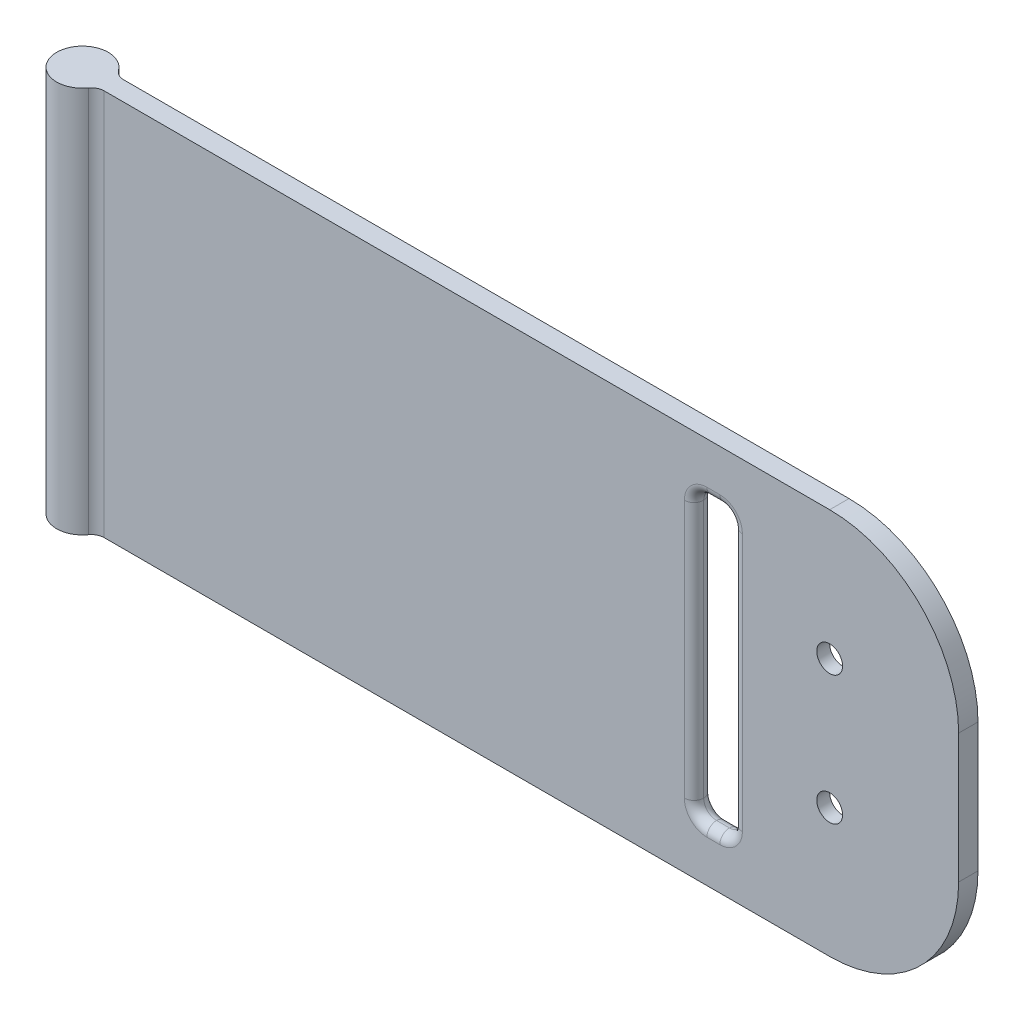
ISO-10303-21;
HEADER;
FILE_DESCRIPTION(('STEP AP214'),'2;1');
FILE_NAME('part.step','',(''),(''),'','','');
FILE_SCHEMA(('AUTOMOTIVE_DESIGN { 1 0 10303 214 1 1 1 1 }'));
ENDSEC;
DATA;
#1=APPLICATION_CONTEXT('core data for automotive mechanical design processes');
#2=APPLICATION_PROTOCOL_DEFINITION('international standard','automotive_design',2000,#1);
#3=PRODUCT_CONTEXT('',#1,'mechanical');
#4=PRODUCT('Part','Part','',(#3));
#5=PRODUCT_RELATED_PRODUCT_CATEGORY('part','',(#4));
#6=PRODUCT_DEFINITION_FORMATION('','',#4);
#7=PRODUCT_DEFINITION_CONTEXT('part definition',#1,'design');
#8=PRODUCT_DEFINITION('design','',#6,#7);
#9=PRODUCT_DEFINITION_SHAPE('','',#8);
#10=(LENGTH_UNIT() NAMED_UNIT(*) SI_UNIT(.MILLI.,.METRE.));
#11=(NAMED_UNIT(*) PLANE_ANGLE_UNIT() SI_UNIT($,.RADIAN.));
#12=(NAMED_UNIT(*) SI_UNIT($,.STERADIAN.) SOLID_ANGLE_UNIT());
#13=UNCERTAINTY_MEASURE_WITH_UNIT(LENGTH_MEASURE(1.E-05),#10,'distance_accuracy_value','');
#14=(GEOMETRIC_REPRESENTATION_CONTEXT(3) GLOBAL_UNCERTAINTY_ASSIGNED_CONTEXT((#13)) GLOBAL_UNIT_ASSIGNED_CONTEXT((#10,
#11,#12)) REPRESENTATION_CONTEXT('',''));
#15=CARTESIAN_POINT('',(0.,0.,0.));
#16=DIRECTION('',(0.,0.,1.));
#17=DIRECTION('',(1.,0.,0.));
#18=AXIS2_PLACEMENT_3D('',#15,#16,#17);
#19=CARTESIAN_POINT('',(0.,30.,0.));
#20=DIRECTION('',(0.,-1.,0.));
#21=DIRECTION('',(0.,0.,-1.));
#22=AXIS2_PLACEMENT_3D('',#19,#20,#21);
#23=CYLINDRICAL_SURFACE('',#22,2.);
#24=CARTESIAN_POINT('',(0.,0.,0.));
#25=DIRECTION('',(0.,1.,0.));
#26=DIRECTION('',(0.,0.,1.));
#27=AXIS2_PLACEMENT_3D('',#24,#25,#26);
#28=CIRCLE('',#27,2.);
#29=CARTESIAN_POINT('',(1.62446572413483,0.,-1.16666666666667));
#30=VERTEX_POINT('',#29);
#31=CARTESIAN_POINT('',(1.62446572413483,0.,1.16666666666667));
#32=VERTEX_POINT('',#31);
#33=EDGE_CURVE('E270',#30,#32,#28,.T.);
#34=ORIENTED_EDGE('',*,*,#33,.T.);
#35=DIRECTION('',(0.,-1.,0.));
#36=VECTOR('',#35,1.);
#37=CARTESIAN_POINT('',(1.62446572413483,30.,1.16666666666667));
#38=LINE('',#37,#36);
#39=CARTESIAN_POINT('',(1.62446572413483,30.,1.16666666666667));
#40=VERTEX_POINT('',#39);
#41=EDGE_CURVE('E321',#40,#32,#38,.T.);
#42=ORIENTED_EDGE('',*,*,#41,.F.);
#43=CARTESIAN_POINT('',(0.,30.,0.));
#44=DIRECTION('',(0.,1.,0.));
#45=DIRECTION('',(0.,0.,1.));
#46=AXIS2_PLACEMENT_3D('',#43,#44,#45);
#47=CIRCLE('',#46,2.);
#48=CARTESIAN_POINT('',(1.62446572413483,30.,-1.16666666666667));
#49=VERTEX_POINT('',#48);
#50=EDGE_CURVE('E281',#49,#40,#47,.T.);
#51=ORIENTED_EDGE('',*,*,#50,.F.);
#52=DIRECTION('',(0.,-1.,0.));
#53=VECTOR('',#52,1.);
#54=CARTESIAN_POINT('',(1.62446572413483,30.,-1.16666666666667));
#55=LINE('',#54,#53);
#56=EDGE_CURVE('E297',#49,#30,#55,.T.);
#57=ORIENTED_EDGE('',*,*,#56,.T.);
#58=EDGE_LOOP('',(#34,#42,#51,#57));
#59=FACE_BOUND('',#58,.T.);
#60=ADVANCED_FACE('F36',(#59),#23,.T.);
#61=CARTESIAN_POINT('',(2.43669858620224,30.,1.75));
#62=DIRECTION('',(0.,-1.,0.));
#63=DIRECTION('',(0.,0.,-1.));
#64=AXIS2_PLACEMENT_3D('',#61,#62,#63);
#65=CYLINDRICAL_SURFACE('',#64,1.);
#66=CARTESIAN_POINT('',(2.43669858620224,0.,1.75));
#67=DIRECTION('',(0.,-1.,0.));
#68=DIRECTION('',(0.,0.,1.));
#69=AXIS2_PLACEMENT_3D('',#66,#67,#68);
#70=CIRCLE('',#69,1.);
#71=CARTESIAN_POINT('',(2.43669858620224,0.,0.75));
#72=VERTEX_POINT('',#71);
#73=EDGE_CURVE('E94',#32,#72,#70,.T.);
#74=ORIENTED_EDGE('',*,*,#73,.T.);
#75=DIRECTION('',(0.,-1.,0.));
#76=VECTOR('',#75,1.);
#77=CARTESIAN_POINT('',(2.43669858620224,30.,0.75));
#78=LINE('',#77,#76);
#79=CARTESIAN_POINT('',(2.43669858620224,30.,0.75));
#80=VERTEX_POINT('',#79);
#81=EDGE_CURVE('E318',#80,#72,#78,.T.);
#82=ORIENTED_EDGE('',*,*,#81,.F.);
#83=CARTESIAN_POINT('',(2.43669858620224,30.,1.75));
#84=DIRECTION('',(0.,-1.,0.));
#85=DIRECTION('',(0.,0.,1.));
#86=AXIS2_PLACEMENT_3D('',#83,#84,#85);
#87=CIRCLE('',#86,1.);
#88=EDGE_CURVE('E284',#40,#80,#87,.T.);
#89=ORIENTED_EDGE('',*,*,#88,.F.);
#90=ORIENTED_EDGE('',*,*,#41,.T.);
#91=EDGE_LOOP('',(#74,#82,#89,#90));
#92=FACE_BOUND('',#91,.T.);
#93=ADVANCED_FACE('F412',(#92),#65,.F.);
#94=CARTESIAN_POINT('',(68.6834985862022,30.,0.749999999999999));
#95=DIRECTION('',(0.,0.,-1.));
#96=DIRECTION('',(-1.,0.,0.));
#97=AXIS2_PLACEMENT_3D('',#94,#95,#96);
#98=PLANE('',#97);
#99=DIRECTION('',(0.,-1.,0.));
#100=VECTOR('',#99,1.);
#101=CARTESIAN_POINT('',(47.4144885862022,30.,0.749999999999999));
#102=LINE('',#101,#100);
#103=CARTESIAN_POINT('',(47.4144885862022,5.00000000000002,0.749999999999999));
#104=VERTEX_POINT('',#103);
#105=CARTESIAN_POINT('',(47.4144885862022,25.,0.749999999999999));
#106=VERTEX_POINT('',#105);
#107=EDGE_CURVE('E341',#104,#106,#102,.F.);
#108=ORIENTED_EDGE('',*,*,#107,.T.);
#109=CARTESIAN_POINT('',(49.1644885862022,25.,0.749999999999999));
#110=DIRECTION('',(0.,0.,-1.));
#111=DIRECTION('',(-1.,0.,0.));
#112=AXIS2_PLACEMENT_3D('',#109,#110,#111);
#113=CIRCLE('',#112,1.75);
#114=CARTESIAN_POINT('',(49.1644885862022,26.75,0.749999999999999));
#115=VERTEX_POINT('',#114);
#116=EDGE_CURVE('E359',#106,#115,#113,.T.);
#117=ORIENTED_EDGE('',*,*,#116,.T.);
#118=DIRECTION('',(-1.,0.,0.));
#119=VECTOR('',#118,1.);
#120=CARTESIAN_POINT('',(68.6834985862022,26.75,0.749999999999999));
#121=LINE('',#120,#119);
#122=CARTESIAN_POINT('',(50.1644885862022,26.75,0.749999999999999));
#123=VERTEX_POINT('',#122);
#124=EDGE_CURVE('E357',#115,#123,#121,.F.);
#125=ORIENTED_EDGE('',*,*,#124,.T.);
#126=CARTESIAN_POINT('',(50.1644885862022,25.,0.749999999999999));
#127=DIRECTION('',(0.,0.,-1.));
#128=DIRECTION('',(-1.,0.,0.));
#129=AXIS2_PLACEMENT_3D('',#126,#127,#128);
#130=CIRCLE('',#129,1.75);
#131=CARTESIAN_POINT('',(51.9144885862022,25.,0.749999999999999));
#132=VERTEX_POINT('',#131);
#133=EDGE_CURVE('E355',#123,#132,#130,.T.);
#134=ORIENTED_EDGE('',*,*,#133,.T.);
#135=DIRECTION('',(0.,1.,0.));
#136=VECTOR('',#135,1.);
#137=CARTESIAN_POINT('',(51.9144885862022,30.,0.749999999999999));
#138=LINE('',#137,#136);
#139=CARTESIAN_POINT('',(51.9144885862022,5.00000000000002,0.749999999999999));
#140=VERTEX_POINT('',#139);
#141=EDGE_CURVE('E353',#132,#140,#138,.F.);
#142=ORIENTED_EDGE('',*,*,#141,.T.);
#143=CARTESIAN_POINT('',(50.1644885862022,5.00000000000002,0.749999999999999));
#144=DIRECTION('',(0.,0.,-1.));
#145=DIRECTION('',(-1.,0.,0.));
#146=AXIS2_PLACEMENT_3D('',#143,#144,#145);
#147=CIRCLE('',#146,1.75);
#148=CARTESIAN_POINT('',(50.1644885862022,3.25000000000002,0.749999999999999));
#149=VERTEX_POINT('',#148);
#150=EDGE_CURVE('E351',#140,#149,#147,.T.);
#151=ORIENTED_EDGE('',*,*,#150,.T.);
#152=DIRECTION('',(1.,0.,0.));
#153=VECTOR('',#152,1.);
#154=CARTESIAN_POINT('',(68.6834985862022,3.25000000000002,0.749999999999999));
#155=LINE('',#154,#153);
#156=CARTESIAN_POINT('',(49.1644885862022,3.25000000000002,0.749999999999999));
#157=VERTEX_POINT('',#156);
#158=EDGE_CURVE('E349',#149,#157,#155,.F.);
#159=ORIENTED_EDGE('',*,*,#158,.T.);
#160=CARTESIAN_POINT('',(49.1644885862022,5.00000000000002,0.749999999999999));
#161=DIRECTION('',(0.,0.,-1.));
#162=DIRECTION('',(-1.,0.,0.));
#163=AXIS2_PLACEMENT_3D('',#160,#161,#162);
#164=CIRCLE('',#163,1.75);
#165=EDGE_CURVE('E347',#157,#104,#164,.T.);
#166=ORIENTED_EDGE('',*,*,#165,.T.);
#167=EDGE_LOOP('',(#108,#117,#125,#134,#142,#151,#159,#166));
#168=FACE_BOUND('',#167,.T.);
#169=CARTESIAN_POINT('',(58.6834985862022,20.,0.749999999999999));
#170=DIRECTION('',(0.,0.,-1.));
#171=DIRECTION('',(-1.,0.,0.));
#172=AXIS2_PLACEMENT_3D('',#169,#170,#171);
#173=CIRCLE('',#172,0.999999999999998);
#174=CARTESIAN_POINT('',(57.6834985862022,20.,0.749999999999999));
#175=VERTEX_POINT('',#174);
#176=EDGE_CURVE('E280',#175,#175,#173,.T.);
#177=ORIENTED_EDGE('',*,*,#176,.T.);
#178=EDGE_LOOP('',(#177));
#179=FACE_BOUND('',#178,.T.);
#180=CARTESIAN_POINT('',(58.6834985862022,10.,0.749999999999999));
#181=DIRECTION('',(0.,0.,-1.));
#182=DIRECTION('',(-1.,0.,0.));
#183=AXIS2_PLACEMENT_3D('',#180,#181,#182);
#184=CIRCLE('',#183,0.999999999999998);
#185=CARTESIAN_POINT('',(57.6834985862022,10.,0.749999999999999));
#186=VERTEX_POINT('',#185);
#187=EDGE_CURVE('E264',#186,#186,#184,.T.);
#188=ORIENTED_EDGE('',*,*,#187,.T.);
#189=EDGE_LOOP('',(#188));
#190=FACE_BOUND('',#189,.T.);
#191=DIRECTION('',(1.,0.,0.));
#192=VECTOR('',#191,1.);
#193=CARTESIAN_POINT('',(68.6834985862022,0.,0.749999999999999));
#194=LINE('',#193,#192);
#195=CARTESIAN_POINT('',(58.6834985862022,0.,0.749999999999999));
#196=VERTEX_POINT('',#195);
#197=EDGE_CURVE('E301',#72,#196,#194,.T.);
#198=ORIENTED_EDGE('',*,*,#197,.T.);
#199=CARTESIAN_POINT('',(58.6834985862022,10.,0.749999999999999));
#200=DIRECTION('',(0.,0.,-1.));
#201=DIRECTION('',(-1.,0.,0.));
#202=AXIS2_PLACEMENT_3D('',#199,#200,#201);
#203=CIRCLE('',#202,10.);
#204=CARTESIAN_POINT('',(68.6834985862022,10.,0.749999999999999));
#205=VERTEX_POINT('',#204);
#206=EDGE_CURVE('E336',#196,#205,#203,.F.);
#207=ORIENTED_EDGE('',*,*,#206,.T.);
#208=DIRECTION('',(0.,-1.,0.));
#209=VECTOR('',#208,1.);
#210=CARTESIAN_POINT('',(68.6834985862022,30.,0.749999999999999));
#211=LINE('',#210,#209);
#212=CARTESIAN_POINT('',(68.6834985862022,20.,0.749999999999999));
#213=VERTEX_POINT('',#212);
#214=EDGE_CURVE('E315',#213,#205,#211,.T.);
#215=ORIENTED_EDGE('',*,*,#214,.F.);
#216=CARTESIAN_POINT('',(58.6834985862022,20.,0.749999999999999));
#217=DIRECTION('',(0.,0.,-1.));
#218=DIRECTION('',(-1.,0.,0.));
#219=AXIS2_PLACEMENT_3D('',#216,#217,#218);
#220=CIRCLE('',#219,10.);
#221=CARTESIAN_POINT('',(58.6834985862022,30.,0.749999999999999));
#222=VERTEX_POINT('',#221);
#223=EDGE_CURVE('E334',#213,#222,#220,.F.);
#224=ORIENTED_EDGE('',*,*,#223,.T.);
#225=DIRECTION('',(1.,0.,0.));
#226=VECTOR('',#225,1.);
#227=CARTESIAN_POINT('',(68.6834985862022,30.,0.749999999999999));
#228=LINE('',#227,#226);
#229=EDGE_CURVE('E288',#80,#222,#228,.T.);
#230=ORIENTED_EDGE('',*,*,#229,.F.);
#231=ORIENTED_EDGE('',*,*,#81,.T.);
#232=EDGE_LOOP('',(#198,#207,#215,#224,#230,#231));
#233=FACE_BOUND('',#232,.T.);
#234=ADVANCED_FACE('F418',(#168,#179,#190,#233),#98,.F.);
#235=CARTESIAN_POINT('',(68.6834985862022,30.,-0.749999999999999));
#236=DIRECTION('',(-1.,0.,0.));
#237=DIRECTION('',(0.,0.,1.));
#238=AXIS2_PLACEMENT_3D('',#235,#236,#237);
#239=PLANE('',#238);
#240=ORIENTED_EDGE('',*,*,#214,.T.);
#241=DIRECTION('',(0.,0.,-1.));
#242=VECTOR('',#241,1.);
#243=CARTESIAN_POINT('',(68.6834985862022,10.,-0.749999999999999));
#244=LINE('',#243,#242);
#245=CARTESIAN_POINT('',(68.6834985862022,10.,-0.749999999999999));
#246=VERTEX_POINT('',#245);
#247=EDGE_CURVE('E325',#205,#246,#244,.T.);
#248=ORIENTED_EDGE('',*,*,#247,.T.);
#249=DIRECTION('',(0.,-1.,0.));
#250=VECTOR('',#249,1.);
#251=CARTESIAN_POINT('',(68.6834985862022,30.,-0.749999999999999));
#252=LINE('',#251,#250);
#253=CARTESIAN_POINT('',(68.6834985862022,20.,-0.749999999999999));
#254=VERTEX_POINT('',#253);
#255=EDGE_CURVE('E312',#254,#246,#252,.T.);
#256=ORIENTED_EDGE('',*,*,#255,.F.);
#257=DIRECTION('',(0.,0.,-1.));
#258=VECTOR('',#257,1.);
#259=CARTESIAN_POINT('',(68.6834985862022,20.,0.749999999999999));
#260=LINE('',#259,#258);
#261=EDGE_CURVE('E323',#254,#213,#260,.F.);
#262=ORIENTED_EDGE('',*,*,#261,.T.);
#263=EDGE_LOOP('',(#240,#248,#256,#262));
#264=FACE_BOUND('',#263,.T.);
#265=ADVANCED_FACE('F666',(#264),#239,.F.);
#266=CARTESIAN_POINT('',(2.43669858620224,30.,-0.75));
#267=DIRECTION('',(0.,0.,1.));
#268=DIRECTION('',(1.,0.,0.));
#269=AXIS2_PLACEMENT_3D('',#266,#267,#268);
#270=PLANE('',#269);
#271=DIRECTION('',(-1.,0.,0.));
#272=VECTOR('',#271,1.);
#273=CARTESIAN_POINT('',(2.43669858620224,26.75,-0.75));
#274=LINE('',#273,#272);
#275=CARTESIAN_POINT('',(50.1644885862022,26.75,-0.749999999999999));
#276=VERTEX_POINT('',#275);
#277=CARTESIAN_POINT('',(49.1644885862022,26.75,-0.749999999999999));
#278=VERTEX_POINT('',#277);
#279=EDGE_CURVE('E46',#276,#278,#274,.T.);
#280=ORIENTED_EDGE('',*,*,#279,.T.);
#281=CARTESIAN_POINT('',(49.1644885862022,25.,-0.749999999999999));
#282=DIRECTION('',(0.,0.,1.));
#283=DIRECTION('',(1.,0.,0.));
#284=AXIS2_PLACEMENT_3D('',#281,#282,#283);
#285=CIRCLE('',#284,1.75);
#286=CARTESIAN_POINT('',(47.4144885862022,25.,-0.749999999999999));
#287=VERTEX_POINT('',#286);
#288=EDGE_CURVE('E11',#278,#287,#285,.T.);
#289=ORIENTED_EDGE('',*,*,#288,.T.);
#290=DIRECTION('',(0.,-1.,0.));
#291=VECTOR('',#290,1.);
#292=CARTESIAN_POINT('',(47.4144885862022,30.,-0.749999999999999));
#293=LINE('',#292,#291);
#294=CARTESIAN_POINT('',(47.4144885862022,5.00000000000002,-0.749999999999999));
#295=VERTEX_POINT('',#294);
#296=EDGE_CURVE('E362',#287,#295,#293,.T.);
#297=ORIENTED_EDGE('',*,*,#296,.T.);
#298=CARTESIAN_POINT('',(49.1644885862022,5.00000000000002,-0.749999999999999));
#299=DIRECTION('',(0.,0.,1.));
#300=DIRECTION('',(1.,0.,0.));
#301=AXIS2_PLACEMENT_3D('',#298,#299,#300);
#302=CIRCLE('',#301,1.75);
#303=CARTESIAN_POINT('',(49.1644885862022,3.25000000000002,-0.749999999999999));
#304=VERTEX_POINT('',#303);
#305=EDGE_CURVE('E364',#295,#304,#302,.T.);
#306=ORIENTED_EDGE('',*,*,#305,.T.);
#307=DIRECTION('',(1.,0.,0.));
#308=VECTOR('',#307,1.);
#309=CARTESIAN_POINT('',(2.43669858620224,3.25000000000002,-0.75));
#310=LINE('',#309,#308);
#311=CARTESIAN_POINT('',(50.1644885862022,3.25000000000002,-0.749999999999999));
#312=VERTEX_POINT('',#311);
#313=EDGE_CURVE('E366',#304,#312,#310,.T.);
#314=ORIENTED_EDGE('',*,*,#313,.T.);
#315=CARTESIAN_POINT('',(50.1644885862022,5.00000000000002,-0.749999999999999));
#316=DIRECTION('',(0.,0.,1.));
#317=DIRECTION('',(1.,0.,0.));
#318=AXIS2_PLACEMENT_3D('',#315,#316,#317);
#319=CIRCLE('',#318,1.75);
#320=CARTESIAN_POINT('',(51.9144885862022,5.00000000000002,-0.749999999999999));
#321=VERTEX_POINT('',#320);
#322=EDGE_CURVE('E179',#312,#321,#319,.T.);
#323=ORIENTED_EDGE('',*,*,#322,.T.);
#324=DIRECTION('',(0.,1.,0.));
#325=VECTOR('',#324,1.);
#326=CARTESIAN_POINT('',(51.9144885862022,30.,-0.749999999999999));
#327=LINE('',#326,#325);
#328=CARTESIAN_POINT('',(51.9144885862022,25.,-0.749999999999999));
#329=VERTEX_POINT('',#328);
#330=EDGE_CURVE('E172',#321,#329,#327,.T.);
#331=ORIENTED_EDGE('',*,*,#330,.T.);
#332=CARTESIAN_POINT('',(50.1644885862022,25.,-0.749999999999999));
#333=DIRECTION('',(0.,0.,1.));
#334=DIRECTION('',(1.,0.,0.));
#335=AXIS2_PLACEMENT_3D('',#332,#333,#334);
#336=CIRCLE('',#335,1.75);
#337=EDGE_CURVE('E177',#329,#276,#336,.T.);
#338=ORIENTED_EDGE('',*,*,#337,.T.);
#339=EDGE_LOOP('',(#280,#289,#297,#306,#314,#323,#331,#338));
#340=FACE_BOUND('',#339,.T.);
#341=CARTESIAN_POINT('',(58.6834985862022,20.,-0.749999999999999));
#342=DIRECTION('',(0.,0.,-1.));
#343=DIRECTION('',(-1.,0.,0.));
#344=AXIS2_PLACEMENT_3D('',#341,#342,#343);
#345=CIRCLE('',#344,2.);
#346=CARTESIAN_POINT('',(56.6834985862022,20.,-0.749999999999999));
#347=VERTEX_POINT('',#346);
#348=EDGE_CURVE('E271',#347,#347,#345,.T.);
#349=ORIENTED_EDGE('',*,*,#348,.F.);
#350=EDGE_LOOP('',(#349));
#351=FACE_BOUND('',#350,.T.);
#352=CARTESIAN_POINT('',(58.6834985862022,10.,-0.749999999999999));
#353=DIRECTION('',(0.,0.,-1.));
#354=DIRECTION('',(-1.,0.,0.));
#355=AXIS2_PLACEMENT_3D('',#352,#353,#354);
#356=CIRCLE('',#355,2.);
#357=CARTESIAN_POINT('',(56.6834985862022,10.,-0.749999999999999));
#358=VERTEX_POINT('',#357);
#359=EDGE_CURVE('E277',#358,#358,#356,.T.);
#360=ORIENTED_EDGE('',*,*,#359,.F.);
#361=EDGE_LOOP('',(#360));
#362=FACE_BOUND('',#361,.T.);
#363=ORIENTED_EDGE('',*,*,#255,.T.);
#364=CARTESIAN_POINT('',(58.6834985862022,10.,-0.749999999999999));
#365=DIRECTION('',(0.,0.,1.));
#366=DIRECTION('',(1.,0.,0.));
#367=AXIS2_PLACEMENT_3D('',#364,#365,#366);
#368=CIRCLE('',#367,10.);
#369=CARTESIAN_POINT('',(58.6834985862022,0.,-0.749999999999999));
#370=VERTEX_POINT('',#369);
#371=EDGE_CURVE('E330',#246,#370,#368,.F.);
#372=ORIENTED_EDGE('',*,*,#371,.T.);
#373=DIRECTION('',(-1.,0.,0.));
#374=VECTOR('',#373,1.);
#375=CARTESIAN_POINT('',(2.43669858620224,0.,-0.75));
#376=LINE('',#375,#374);
#377=CARTESIAN_POINT('',(2.43669858620224,0.,-0.749999999999998));
#378=VERTEX_POINT('',#377);
#379=EDGE_CURVE('E304',#370,#378,#376,.T.);
#380=ORIENTED_EDGE('',*,*,#379,.T.);
#381=DIRECTION('',(0.,-1.,0.));
#382=VECTOR('',#381,1.);
#383=CARTESIAN_POINT('',(2.43669858620224,30.,-0.749999999999998));
#384=LINE('',#383,#382);
#385=CARTESIAN_POINT('',(2.43669858620224,30.,-0.749999999999998));
#386=VERTEX_POINT('',#385);
#387=EDGE_CURVE('E309',#386,#378,#384,.T.);
#388=ORIENTED_EDGE('',*,*,#387,.F.);
#389=DIRECTION('',(-1.,0.,0.));
#390=VECTOR('',#389,1.);
#391=CARTESIAN_POINT('',(2.43669858620224,30.,-0.75));
#392=LINE('',#391,#390);
#393=CARTESIAN_POINT('',(58.6834985862022,30.,-0.749999999999999));
#394=VERTEX_POINT('',#393);
#395=EDGE_CURVE('E291',#394,#386,#392,.T.);
#396=ORIENTED_EDGE('',*,*,#395,.F.);
#397=CARTESIAN_POINT('',(58.6834985862022,20.,-0.749999999999999));
#398=DIRECTION('',(0.,0.,1.));
#399=DIRECTION('',(1.,0.,0.));
#400=AXIS2_PLACEMENT_3D('',#397,#398,#399);
#401=CIRCLE('',#400,10.);
#402=EDGE_CURVE('E328',#394,#254,#401,.F.);
#403=ORIENTED_EDGE('',*,*,#402,.T.);
#404=EDGE_LOOP('',(#363,#372,#380,#388,#396,#403));
#405=FACE_BOUND('',#404,.T.);
#406=ADVANCED_FACE('F174',(#340,#351,#362,#405),#270,.F.);
#407=CARTESIAN_POINT('',(2.43669858620224,30.,-1.75));
#408=DIRECTION('',(0.,-1.,0.));
#409=DIRECTION('',(0.,0.,-1.));
#410=AXIS2_PLACEMENT_3D('',#407,#408,#409);
#411=CYLINDRICAL_SURFACE('',#410,1.);
#412=CARTESIAN_POINT('',(2.43669858620224,0.,-1.75));
#413=DIRECTION('',(0.,-1.,0.));
#414=DIRECTION('',(0.,0.,-1.));
#415=AXIS2_PLACEMENT_3D('',#412,#413,#414);
#416=CIRCLE('',#415,1.);
#417=EDGE_CURVE('E285',#378,#30,#416,.T.);
#418=ORIENTED_EDGE('',*,*,#417,.T.);
#419=ORIENTED_EDGE('',*,*,#56,.F.);
#420=CARTESIAN_POINT('',(2.43669858620224,30.,-1.75));
#421=DIRECTION('',(0.,-1.,0.));
#422=DIRECTION('',(0.,0.,-1.));
#423=AXIS2_PLACEMENT_3D('',#420,#421,#422);
#424=CIRCLE('',#423,1.);
#425=EDGE_CURVE('E294',#386,#49,#424,.T.);
#426=ORIENTED_EDGE('',*,*,#425,.F.);
#427=ORIENTED_EDGE('',*,*,#387,.T.);
#428=EDGE_LOOP('',(#418,#419,#426,#427));
#429=FACE_BOUND('',#428,.T.);
#430=ADVANCED_FACE('F648',(#429),#411,.F.);
#431=CARTESIAN_POINT('',(0.,30.,0.));
#432=DIRECTION('',(0.,1.,0.));
#433=DIRECTION('',(0.,0.,1.));
#434=AXIS2_PLACEMENT_3D('',#431,#432,#433);
#435=PLANE('',#434);
#436=ORIENTED_EDGE('',*,*,#229,.T.);
#437=DIRECTION('',(0.,0.,-1.));
#438=VECTOR('',#437,1.);
#439=CARTESIAN_POINT('',(58.6834985862022,30.,-0.749999999999999));
#440=LINE('',#439,#438);
#441=EDGE_CURVE('E338',#222,#394,#440,.T.);
#442=ORIENTED_EDGE('',*,*,#441,.T.);
#443=ORIENTED_EDGE('',*,*,#395,.T.);
#444=ORIENTED_EDGE('',*,*,#425,.T.);
#445=ORIENTED_EDGE('',*,*,#50,.T.);
#446=ORIENTED_EDGE('',*,*,#88,.T.);
#447=EDGE_LOOP('',(#436,#442,#443,#444,#445,#446));
#448=FACE_BOUND('',#447,.T.);
#449=ADVANCED_FACE('F640',(#448),#435,.T.);
#450=CARTESIAN_POINT('',(0.,0.,0.));
#451=DIRECTION('',(0.,1.,0.));
#452=DIRECTION('',(0.,0.,1.));
#453=AXIS2_PLACEMENT_3D('',#450,#451,#452);
#454=PLANE('',#453);
#455=ORIENTED_EDGE('',*,*,#379,.F.);
#456=DIRECTION('',(0.,0.,-1.));
#457=VECTOR('',#456,1.);
#458=CARTESIAN_POINT('',(58.6834985862022,0.,0.));
#459=LINE('',#458,#457);
#460=EDGE_CURVE('E332',#370,#196,#459,.F.);
#461=ORIENTED_EDGE('',*,*,#460,.T.);
#462=ORIENTED_EDGE('',*,*,#197,.F.);
#463=ORIENTED_EDGE('',*,*,#73,.F.);
#464=ORIENTED_EDGE('',*,*,#33,.F.);
#465=ORIENTED_EDGE('',*,*,#417,.F.);
#466=EDGE_LOOP('',(#455,#461,#462,#463,#464,#465));
#467=FACE_BOUND('',#466,.T.);
#468=ADVANCED_FACE('F427',(#467),#454,.F.);
#469=CARTESIAN_POINT('',(58.6834985862022,10.,-0.749999999999999));
#470=DIRECTION('',(0.,0.,-1.));
#471=DIRECTION('',(-1.,0.,0.));
#472=AXIS2_PLACEMENT_3D('',#469,#470,#471);
#473=CYLINDRICAL_SURFACE('',#472,10.);
#474=ORIENTED_EDGE('',*,*,#206,.F.);
#475=ORIENTED_EDGE('',*,*,#460,.F.);
#476=ORIENTED_EDGE('',*,*,#371,.F.);
#477=ORIENTED_EDGE('',*,*,#247,.F.);
#478=EDGE_LOOP('',(#474,#475,#476,#477));
#479=FACE_BOUND('',#478,.T.);
#480=ADVANCED_FACE('F423',(#479),#473,.T.);
#481=CARTESIAN_POINT('',(58.6834985862022,20.,0.));
#482=DIRECTION('',(0.,0.,1.));
#483=DIRECTION('',(1.,0.,0.));
#484=AXIS2_PLACEMENT_3D('',#481,#482,#483);
#485=CYLINDRICAL_SURFACE('',#484,10.);
#486=ORIENTED_EDGE('',*,*,#223,.F.);
#487=ORIENTED_EDGE('',*,*,#261,.F.);
#488=ORIENTED_EDGE('',*,*,#402,.F.);
#489=ORIENTED_EDGE('',*,*,#441,.F.);
#490=EDGE_LOOP('',(#486,#487,#488,#489));
#491=FACE_BOUND('',#490,.T.);
#492=ADVANCED_FACE('F426',(#491),#485,.T.);
#493=CARTESIAN_POINT('',(58.6834985862022,10.,-0.249999999999999));
#494=DIRECTION('',(0.,0.,-1.));
#495=DIRECTION('',(-1.,0.,0.));
#496=AXIS2_PLACEMENT_3D('',#493,#494,#495);
#497=CYLINDRICAL_SURFACE('',#496,2.);
#498=CARTESIAN_POINT('',(58.6834985862022,10.,-0.249999999999999));
#499=DIRECTION('',(0.,0.,-1.));
#500=DIRECTION('',(-1.,0.,0.));
#501=AXIS2_PLACEMENT_3D('',#498,#499,#500);
#502=CIRCLE('',#501,2.);
#503=CARTESIAN_POINT('',(56.6834985862022,10.,-0.249999999999999));
#504=VERTEX_POINT('',#503);
#505=EDGE_CURVE('E274',#504,#504,#502,.T.);
#506=ORIENTED_EDGE('',*,*,#505,.F.);
#507=EDGE_LOOP('',(#506));
#508=FACE_BOUND('',#507,.T.);
#509=ORIENTED_EDGE('',*,*,#359,.T.);
#510=EDGE_LOOP('',(#509));
#511=FACE_BOUND('',#510,.T.);
#512=ADVANCED_FACE('F431',(#508,#511),#497,.F.);
#513=CARTESIAN_POINT('',(58.6834985862022,10.,-0.249999999999999));
#514=DIRECTION('',(0.,0.,-1.));
#515=DIRECTION('',(-1.,0.,0.));
#516=AXIS2_PLACEMENT_3D('',#513,#514,#515);
#517=PLANE('',#516);
#518=CARTESIAN_POINT('',(58.6834985862022,10.,-0.249999999999999));
#519=DIRECTION('',(0.,0.,-1.));
#520=DIRECTION('',(-1.,0.,0.));
#521=AXIS2_PLACEMENT_3D('',#518,#519,#520);
#522=CIRCLE('',#521,0.999999999999998);
#523=CARTESIAN_POINT('',(57.6834985862022,10.,-0.249999999999999));
#524=VERTEX_POINT('',#523);
#525=EDGE_CURVE('E255',#524,#524,#522,.T.);
#526=ORIENTED_EDGE('',*,*,#525,.F.);
#527=EDGE_LOOP('',(#526));
#528=FACE_BOUND('',#527,.T.);
#529=ORIENTED_EDGE('',*,*,#505,.T.);
#530=EDGE_LOOP('',(#529));
#531=FACE_BOUND('',#530,.T.);
#532=ADVANCED_FACE('F606',(#528,#531),#517,.T.);
#533=CARTESIAN_POINT('',(58.6834985862022,20.,-0.249999999999999));
#534=DIRECTION('',(0.,0.,-1.));
#535=DIRECTION('',(-1.,0.,0.));
#536=AXIS2_PLACEMENT_3D('',#533,#534,#535);
#537=CYLINDRICAL_SURFACE('',#536,2.);
#538=CARTESIAN_POINT('',(58.6834985862022,20.,-0.249999999999999));
#539=DIRECTION('',(0.,0.,-1.));
#540=DIRECTION('',(-1.,0.,0.));
#541=AXIS2_PLACEMENT_3D('',#538,#539,#540);
#542=CIRCLE('',#541,2.);
#543=CARTESIAN_POINT('',(56.6834985862022,20.,-0.249999999999999));
#544=VERTEX_POINT('',#543);
#545=EDGE_CURVE('E267',#544,#544,#542,.T.);
#546=ORIENTED_EDGE('',*,*,#545,.F.);
#547=EDGE_LOOP('',(#546));
#548=FACE_BOUND('',#547,.T.);
#549=ORIENTED_EDGE('',*,*,#348,.T.);
#550=EDGE_LOOP('',(#549));
#551=FACE_BOUND('',#550,.T.);
#552=ADVANCED_FACE('F596',(#548,#551),#537,.F.);
#553=CARTESIAN_POINT('',(58.6834985862022,20.,-0.249999999999999));
#554=DIRECTION('',(0.,0.,-1.));
#555=DIRECTION('',(-1.,0.,0.));
#556=AXIS2_PLACEMENT_3D('',#553,#554,#555);
#557=PLANE('',#556);
#558=CARTESIAN_POINT('',(58.6834985862022,20.,-0.249999999999999));
#559=DIRECTION('',(0.,0.,-1.));
#560=DIRECTION('',(-1.,0.,0.));
#561=AXIS2_PLACEMENT_3D('',#558,#559,#560);
#562=CIRCLE('',#561,0.999999999999998);
#563=CARTESIAN_POINT('',(57.6834985862022,20.,-0.249999999999999));
#564=VERTEX_POINT('',#563);
#565=EDGE_CURVE('E259',#564,#564,#562,.T.);
#566=ORIENTED_EDGE('',*,*,#565,.F.);
#567=EDGE_LOOP('',(#566));
#568=FACE_BOUND('',#567,.T.);
#569=ORIENTED_EDGE('',*,*,#545,.T.);
#570=EDGE_LOOP('',(#569));
#571=FACE_BOUND('',#570,.T.);
#572=ADVANCED_FACE('F588',(#568,#571),#557,.T.);
#573=CARTESIAN_POINT('',(58.6834985862022,10.,2.));
#574=DIRECTION('',(0.,0.,-1.));
#575=DIRECTION('',(-1.,0.,0.));
#576=AXIS2_PLACEMENT_3D('',#573,#574,#575);
#577=CYLINDRICAL_SURFACE('',#576,0.999999999999998);
#578=ORIENTED_EDGE('',*,*,#525,.T.);
#579=EDGE_LOOP('',(#578));
#580=FACE_BOUND('',#579,.T.);
#581=ORIENTED_EDGE('',*,*,#187,.F.);
#582=EDGE_LOOP('',(#581));
#583=FACE_BOUND('',#582,.T.);
#584=ADVANCED_FACE('F578',(#580,#583),#577,.F.);
#585=CARTESIAN_POINT('',(58.6834985862022,20.,2.));
#586=DIRECTION('',(0.,0.,-1.));
#587=DIRECTION('',(-1.,0.,0.));
#588=AXIS2_PLACEMENT_3D('',#585,#586,#587);
#589=CYLINDRICAL_SURFACE('',#588,0.999999999999998);
#590=ORIENTED_EDGE('',*,*,#565,.T.);
#591=EDGE_LOOP('',(#590));
#592=FACE_BOUND('',#591,.T.);
#593=ORIENTED_EDGE('',*,*,#176,.F.);
#594=EDGE_LOOP('',(#593));
#595=FACE_BOUND('',#594,.T.);
#596=ADVANCED_FACE('F410',(#592,#595),#589,.F.);
#597=CARTESIAN_POINT('',(50.1644885862022,5.00000000000002,0.));
#598=DIRECTION('',(0.,0.,1.));
#599=DIRECTION('',(1.,0.,0.));
#600=AXIS2_PLACEMENT_3D('',#597,#598,#599);
#601=TOROIDAL_SURFACE('',#600,1.75,0.75);
#602=CARTESIAN_POINT('',(51.9144885862022,5.00000000000002,0.));
#603=DIRECTION('',(0.,1.,0.));
#604=DIRECTION('',(0.,0.,1.));
#605=AXIS2_PLACEMENT_3D('',#602,#603,#604);
#606=CIRCLE('',#605,0.75);
#607=CARTESIAN_POINT('',(51.1644885862022,5.00000000000002,0.));
#608=VERTEX_POINT('',#607);
#609=EDGE_CURVE('E250',#321,#608,#606,.T.);
#610=ORIENTED_EDGE('',*,*,#609,.F.);
#611=ORIENTED_EDGE('',*,*,#322,.F.);
#612=CARTESIAN_POINT('',(50.1644885862022,3.25000000000002,0.));
#613=DIRECTION('',(-1.,0.,0.));
#614=DIRECTION('',(0.,0.,1.));
#615=AXIS2_PLACEMENT_3D('',#612,#613,#614);
#616=CIRCLE('',#615,0.75);
#617=CARTESIAN_POINT('',(50.1644885862022,4.00000000000002,0.));
#618=VERTEX_POINT('',#617);
#619=EDGE_CURVE('E40',#618,#312,#616,.T.);
#620=ORIENTED_EDGE('',*,*,#619,.F.);
#621=CARTESIAN_POINT('',(50.1644885862022,5.00000000000002,0.));
#622=DIRECTION('',(0.,0.,1.));
#623=DIRECTION('',(1.,0.,0.));
#624=AXIS2_PLACEMENT_3D('',#621,#622,#623);
#625=CIRCLE('',#624,1.);
#626=EDGE_CURVE('E82',#608,#618,#625,.F.);
#627=ORIENTED_EDGE('',*,*,#626,.F.);
#628=EDGE_LOOP('',(#610,#611,#620,#627));
#629=FACE_BOUND('',#628,.T.);
#630=ADVANCED_FACE('F38',(#629),#601,.T.);
#631=CARTESIAN_POINT('',(2.43669858620224,3.25000000000002,0.));
#632=DIRECTION('',(1.,0.,0.));
#633=DIRECTION('',(0.,0.,-1.));
#634=AXIS2_PLACEMENT_3D('',#631,#632,#633);
#635=CYLINDRICAL_SURFACE('',#634,0.75);
#636=ORIENTED_EDGE('',*,*,#619,.T.);
#637=ORIENTED_EDGE('',*,*,#313,.F.);
#638=CARTESIAN_POINT('',(49.1644885862022,3.25000000000002,0.));
#639=DIRECTION('',(-1.,0.,0.));
#640=DIRECTION('',(0.,0.,1.));
#641=AXIS2_PLACEMENT_3D('',#638,#639,#640);
#642=CIRCLE('',#641,0.75);
#643=CARTESIAN_POINT('',(49.1644885862022,4.00000000000002,0.));
#644=VERTEX_POINT('',#643);
#645=EDGE_CURVE('E247',#644,#304,#642,.T.);
#646=ORIENTED_EDGE('',*,*,#645,.F.);
#647=DIRECTION('',(1.,0.,0.));
#648=VECTOR('',#647,1.);
#649=CARTESIAN_POINT('',(48.1644885862022,4.00000000000002,0.));
#650=LINE('',#649,#648);
#651=EDGE_CURVE('E244',#618,#644,#650,.F.);
#652=ORIENTED_EDGE('',*,*,#651,.F.);
#653=EDGE_LOOP('',(#636,#637,#646,#652));
#654=FACE_BOUND('',#653,.T.);
#655=ADVANCED_FACE('F403',(#654),#635,.T.);
#656=CARTESIAN_POINT('',(50.1644885862022,5.00000000000002,0.));
#657=DIRECTION('',(0.,0.,-1.));
#658=DIRECTION('',(-1.,0.,0.));
#659=AXIS2_PLACEMENT_3D('',#656,#657,#658);
#660=TOROIDAL_SURFACE('',#659,1.75,0.75);
#661=CARTESIAN_POINT('',(51.9144885862022,5.00000000000002,0.));
#662=DIRECTION('',(0.,1.,0.));
#663=DIRECTION('',(0.,0.,1.));
#664=AXIS2_PLACEMENT_3D('',#661,#662,#663);
#665=CIRCLE('',#664,0.75);
#666=EDGE_CURVE('E238',#608,#140,#665,.T.);
#667=ORIENTED_EDGE('',*,*,#666,.F.);
#668=ORIENTED_EDGE('',*,*,#626,.T.);
#669=CARTESIAN_POINT('',(50.1644885862022,3.25000000000002,0.));
#670=DIRECTION('',(-1.,0.,0.));
#671=DIRECTION('',(0.,0.,1.));
#672=AXIS2_PLACEMENT_3D('',#669,#670,#671);
#673=CIRCLE('',#672,0.75);
#674=EDGE_CURVE('E241',#149,#618,#673,.T.);
#675=ORIENTED_EDGE('',*,*,#674,.F.);
#676=ORIENTED_EDGE('',*,*,#150,.F.);
#677=EDGE_LOOP('',(#667,#668,#675,#676));
#678=FACE_BOUND('',#677,.T.);
#679=ADVANCED_FACE('F369',(#678),#660,.T.);
#680=CARTESIAN_POINT('',(51.9144885862022,30.,0.));
#681=DIRECTION('',(0.,1.,0.));
#682=DIRECTION('',(0.,0.,1.));
#683=AXIS2_PLACEMENT_3D('',#680,#681,#682);
#684=CYLINDRICAL_SURFACE('',#683,0.75);
#685=ORIENTED_EDGE('',*,*,#330,.F.);
#686=ORIENTED_EDGE('',*,*,#609,.T.);
#687=DIRECTION('',(0.,1.,0.));
#688=VECTOR('',#687,1.);
#689=CARTESIAN_POINT('',(51.1644885862022,4.00000000000002,0.));
#690=LINE('',#689,#688);
#691=CARTESIAN_POINT('',(51.1644885862022,25.,0.));
#692=VERTEX_POINT('',#691);
#693=EDGE_CURVE('E186',#692,#608,#690,.F.);
#694=ORIENTED_EDGE('',*,*,#693,.F.);
#695=CARTESIAN_POINT('',(51.9144885862022,25.,0.));
#696=DIRECTION('',(0.,1.,0.));
#697=DIRECTION('',(0.,0.,1.));
#698=AXIS2_PLACEMENT_3D('',#695,#696,#697);
#699=CIRCLE('',#698,0.75);
#700=EDGE_CURVE('E183',#329,#692,#699,.T.);
#701=ORIENTED_EDGE('',*,*,#700,.F.);
#702=EDGE_LOOP('',(#685,#686,#694,#701));
#703=FACE_BOUND('',#702,.T.);
#704=ADVANCED_FACE('F184',(#703),#684,.T.);
#705=CARTESIAN_POINT('',(49.1644885862022,5.00000000000002,0.));
#706=DIRECTION('',(0.,0.,1.));
#707=DIRECTION('',(1.,0.,0.));
#708=AXIS2_PLACEMENT_3D('',#705,#706,#707);
#709=TOROIDAL_SURFACE('',#708,1.75,0.75);
#710=ORIENTED_EDGE('',*,*,#645,.T.);
#711=ORIENTED_EDGE('',*,*,#305,.F.);
#712=CARTESIAN_POINT('',(47.4144885862022,5.00000000000002,0.));
#713=DIRECTION('',(0.,1.,0.));
#714=DIRECTION('',(0.,0.,1.));
#715=AXIS2_PLACEMENT_3D('',#712,#713,#714);
#716=CIRCLE('',#715,0.75);
#717=CARTESIAN_POINT('',(48.1644885862022,5.00000000000002,0.));
#718=VERTEX_POINT('',#717);
#719=EDGE_CURVE('E189',#718,#295,#716,.T.);
#720=ORIENTED_EDGE('',*,*,#719,.F.);
#721=CARTESIAN_POINT('',(49.1644885862022,5.00000000000002,0.));
#722=DIRECTION('',(0.,0.,1.));
#723=DIRECTION('',(1.,0.,0.));
#724=AXIS2_PLACEMENT_3D('',#721,#722,#723);
#725=CIRCLE('',#724,1.);
#726=EDGE_CURVE('E232',#644,#718,#725,.F.);
#727=ORIENTED_EDGE('',*,*,#726,.F.);
#728=EDGE_LOOP('',(#710,#711,#720,#727));
#729=FACE_BOUND('',#728,.T.);
#730=ADVANCED_FACE('F387',(#729),#709,.T.);
#731=CARTESIAN_POINT('',(48.1644885862022,3.25000000000002,0.));
#732=DIRECTION('',(1.,0.,0.));
#733=DIRECTION('',(0.,0.,-1.));
#734=AXIS2_PLACEMENT_3D('',#731,#732,#733);
#735=CYLINDRICAL_SURFACE('',#734,0.75);
#736=ORIENTED_EDGE('',*,*,#674,.T.);
#737=ORIENTED_EDGE('',*,*,#651,.T.);
#738=CARTESIAN_POINT('',(49.1644885862022,3.25000000000002,0.));
#739=DIRECTION('',(-1.,0.,0.));
#740=DIRECTION('',(0.,0.,1.));
#741=AXIS2_PLACEMENT_3D('',#738,#739,#740);
#742=CIRCLE('',#741,0.75);
#743=EDGE_CURVE('E229',#157,#644,#742,.T.);
#744=ORIENTED_EDGE('',*,*,#743,.F.);
#745=ORIENTED_EDGE('',*,*,#158,.F.);
#746=EDGE_LOOP('',(#736,#737,#744,#745));
#747=FACE_BOUND('',#746,.T.);
#748=ADVANCED_FACE('F402',(#747),#735,.T.);
#749=CARTESIAN_POINT('',(51.9144885862022,4.00000000000002,0.));
#750=DIRECTION('',(0.,1.,0.));
#751=DIRECTION('',(0.,0.,1.));
#752=AXIS2_PLACEMENT_3D('',#749,#750,#751);
#753=CYLINDRICAL_SURFACE('',#752,0.75);
#754=ORIENTED_EDGE('',*,*,#666,.T.);
#755=ORIENTED_EDGE('',*,*,#141,.F.);
#756=CARTESIAN_POINT('',(51.9144885862022,25.,0.));
#757=DIRECTION('',(0.,1.,0.));
#758=DIRECTION('',(0.,0.,1.));
#759=AXIS2_PLACEMENT_3D('',#756,#757,#758);
#760=CIRCLE('',#759,0.75);
#761=EDGE_CURVE('E226',#692,#132,#760,.T.);
#762=ORIENTED_EDGE('',*,*,#761,.F.);
#763=ORIENTED_EDGE('',*,*,#693,.T.);
#764=EDGE_LOOP('',(#754,#755,#762,#763));
#765=FACE_BOUND('',#764,.T.);
#766=ADVANCED_FACE('F372',(#765),#753,.T.);
#767=CARTESIAN_POINT('',(50.1644885862022,25.,0.));
#768=DIRECTION('',(0.,0.,1.));
#769=DIRECTION('',(1.,0.,0.));
#770=AXIS2_PLACEMENT_3D('',#767,#768,#769);
#771=TOROIDAL_SURFACE('',#770,1.75,0.75);
#772=ORIENTED_EDGE('',*,*,#337,.F.);
#773=ORIENTED_EDGE('',*,*,#700,.T.);
#774=CARTESIAN_POINT('',(50.1644885862022,25.,0.));
#775=DIRECTION('',(0.,0.,1.));
#776=DIRECTION('',(1.,0.,0.));
#777=AXIS2_PLACEMENT_3D('',#774,#775,#776);
#778=CIRCLE('',#777,1.);
#779=CARTESIAN_POINT('',(50.1644885862022,26.,0.));
#780=VERTEX_POINT('',#779);
#781=EDGE_CURVE('E223',#780,#692,#778,.F.);
#782=ORIENTED_EDGE('',*,*,#781,.F.);
#783=CARTESIAN_POINT('',(50.1644885862022,26.75,0.));
#784=DIRECTION('',(-1.,0.,0.));
#785=DIRECTION('',(0.,0.,1.));
#786=AXIS2_PLACEMENT_3D('',#783,#784,#785);
#787=CIRCLE('',#786,0.75);
#788=EDGE_CURVE('E193',#276,#780,#787,.T.);
#789=ORIENTED_EDGE('',*,*,#788,.F.);
#790=EDGE_LOOP('',(#772,#773,#782,#789));
#791=FACE_BOUND('',#790,.T.);
#792=ADVANCED_FACE('F191',(#791),#771,.T.);
#793=CARTESIAN_POINT('',(47.4144885862022,30.,0.));
#794=DIRECTION('',(0.,-1.,0.));
#795=DIRECTION('',(0.,0.,-1.));
#796=AXIS2_PLACEMENT_3D('',#793,#794,#795);
#797=CYLINDRICAL_SURFACE('',#796,0.75);
#798=ORIENTED_EDGE('',*,*,#719,.T.);
#799=ORIENTED_EDGE('',*,*,#296,.F.);
#800=CARTESIAN_POINT('',(47.4144885862022,25.,0.));
#801=DIRECTION('',(0.,1.,0.));
#802=DIRECTION('',(0.,0.,1.));
#803=AXIS2_PLACEMENT_3D('',#800,#801,#802);
#804=CIRCLE('',#803,0.75);
#805=CARTESIAN_POINT('',(48.1644885862022,25.,0.));
#806=VERTEX_POINT('',#805);
#807=EDGE_CURVE('E218',#806,#287,#804,.T.);
#808=ORIENTED_EDGE('',*,*,#807,.F.);
#809=DIRECTION('',(0.,-1.,0.));
#810=VECTOR('',#809,1.);
#811=CARTESIAN_POINT('',(48.1644885862022,4.00000000000002,0.));
#812=LINE('',#811,#810);
#813=EDGE_CURVE('E215',#718,#806,#812,.F.);
#814=ORIENTED_EDGE('',*,*,#813,.F.);
#815=EDGE_LOOP('',(#798,#799,#808,#814));
#816=FACE_BOUND('',#815,.T.);
#817=ADVANCED_FACE('F390',(#816),#797,.T.);
#818=CARTESIAN_POINT('',(49.1644885862022,5.00000000000002,0.));
#819=DIRECTION('',(0.,0.,-1.));
#820=DIRECTION('',(-1.,0.,0.));
#821=AXIS2_PLACEMENT_3D('',#818,#819,#820);
#822=TOROIDAL_SURFACE('',#821,1.75,0.75);
#823=ORIENTED_EDGE('',*,*,#743,.T.);
#824=ORIENTED_EDGE('',*,*,#726,.T.);
#825=CARTESIAN_POINT('',(47.4144885862022,5.00000000000002,0.));
#826=DIRECTION('',(0.,1.,0.));
#827=DIRECTION('',(0.,0.,1.));
#828=AXIS2_PLACEMENT_3D('',#825,#826,#827);
#829=CIRCLE('',#828,0.75);
#830=EDGE_CURVE('E212',#104,#718,#829,.T.);
#831=ORIENTED_EDGE('',*,*,#830,.F.);
#832=ORIENTED_EDGE('',*,*,#165,.F.);
#833=EDGE_LOOP('',(#823,#824,#831,#832));
#834=FACE_BOUND('',#833,.T.);
#835=ADVANCED_FACE('F398',(#834),#822,.T.);
#836=CARTESIAN_POINT('',(50.1644885862022,25.,0.));
#837=DIRECTION('',(0.,0.,-1.));
#838=DIRECTION('',(-1.,0.,0.));
#839=AXIS2_PLACEMENT_3D('',#836,#837,#838);
#840=TOROIDAL_SURFACE('',#839,1.75,0.75);
#841=ORIENTED_EDGE('',*,*,#761,.T.);
#842=ORIENTED_EDGE('',*,*,#133,.F.);
#843=CARTESIAN_POINT('',(50.1644885862022,26.75,0.));
#844=DIRECTION('',(-1.,0.,0.));
#845=DIRECTION('',(0.,0.,1.));
#846=AXIS2_PLACEMENT_3D('',#843,#844,#845);
#847=CIRCLE('',#846,0.75);
#848=EDGE_CURVE('E209',#780,#123,#847,.T.);
#849=ORIENTED_EDGE('',*,*,#848,.F.);
#850=ORIENTED_EDGE('',*,*,#781,.T.);
#851=EDGE_LOOP('',(#841,#842,#849,#850));
#852=FACE_BOUND('',#851,.T.);
#853=ADVANCED_FACE('F376',(#852),#840,.T.);
#854=CARTESIAN_POINT('',(2.43669858620224,26.75,0.));
#855=DIRECTION('',(-1.,0.,0.));
#856=DIRECTION('',(0.,0.,1.));
#857=AXIS2_PLACEMENT_3D('',#854,#855,#856);
#858=CYLINDRICAL_SURFACE('',#857,0.75);
#859=CARTESIAN_POINT('',(49.1644885862022,26.75,0.));
#860=DIRECTION('',(-1.,0.,0.));
#861=DIRECTION('',(0.,0.,1.));
#862=AXIS2_PLACEMENT_3D('',#859,#860,#861);
#863=CIRCLE('',#862,0.75);
#864=CARTESIAN_POINT('',(49.1644885862022,26.,0.));
#865=VERTEX_POINT('',#864);
#866=EDGE_CURVE('E220',#278,#865,#863,.T.);
#867=ORIENTED_EDGE('',*,*,#866,.F.);
#868=ORIENTED_EDGE('',*,*,#279,.F.);
#869=ORIENTED_EDGE('',*,*,#788,.T.);
#870=DIRECTION('',(-1.,0.,0.));
#871=VECTOR('',#870,1.);
#872=CARTESIAN_POINT('',(48.1644885862022,26.,0.));
#873=LINE('',#872,#871);
#874=EDGE_CURVE('E206',#865,#780,#873,.F.);
#875=ORIENTED_EDGE('',*,*,#874,.F.);
#876=EDGE_LOOP('',(#867,#868,#869,#875));
#877=FACE_BOUND('',#876,.T.);
#878=ADVANCED_FACE('F379',(#877),#858,.T.);
#879=CARTESIAN_POINT('',(49.1644885862022,25.,0.));
#880=DIRECTION('',(0.,0.,1.));
#881=DIRECTION('',(1.,0.,0.));
#882=AXIS2_PLACEMENT_3D('',#879,#880,#881);
#883=TOROIDAL_SURFACE('',#882,1.75,0.75);
#884=ORIENTED_EDGE('',*,*,#288,.F.);
#885=ORIENTED_EDGE('',*,*,#866,.T.);
#886=CARTESIAN_POINT('',(49.1644885862022,25.,0.));
#887=DIRECTION('',(0.,0.,1.));
#888=DIRECTION('',(1.,0.,0.));
#889=AXIS2_PLACEMENT_3D('',#886,#887,#888);
#890=CIRCLE('',#889,1.);
#891=EDGE_CURVE('E203',#806,#865,#890,.F.);
#892=ORIENTED_EDGE('',*,*,#891,.F.);
#893=ORIENTED_EDGE('',*,*,#807,.T.);
#894=EDGE_LOOP('',(#884,#885,#892,#893));
#895=FACE_BOUND('',#894,.T.);
#896=ADVANCED_FACE('F383',(#895),#883,.T.);
#897=CARTESIAN_POINT('',(47.4144885862022,4.00000000000002,0.));
#898=DIRECTION('',(0.,-1.,0.));
#899=DIRECTION('',(0.,0.,-1.));
#900=AXIS2_PLACEMENT_3D('',#897,#898,#899);
#901=CYLINDRICAL_SURFACE('',#900,0.75);
#902=ORIENTED_EDGE('',*,*,#830,.T.);
#903=ORIENTED_EDGE('',*,*,#813,.T.);
#904=CARTESIAN_POINT('',(47.4144885862022,25.,0.));
#905=DIRECTION('',(0.,1.,0.));
#906=DIRECTION('',(0.,0.,1.));
#907=AXIS2_PLACEMENT_3D('',#904,#905,#906);
#908=CIRCLE('',#907,0.75);
#909=EDGE_CURVE('E200',#106,#806,#908,.T.);
#910=ORIENTED_EDGE('',*,*,#909,.F.);
#911=ORIENTED_EDGE('',*,*,#107,.F.);
#912=EDGE_LOOP('',(#902,#903,#910,#911));
#913=FACE_BOUND('',#912,.T.);
#914=ADVANCED_FACE('F395',(#913),#901,.T.);
#915=CARTESIAN_POINT('',(48.1644885862022,26.75,0.));
#916=DIRECTION('',(-1.,0.,0.));
#917=DIRECTION('',(0.,0.,1.));
#918=AXIS2_PLACEMENT_3D('',#915,#916,#917);
#919=CYLINDRICAL_SURFACE('',#918,0.75);
#920=ORIENTED_EDGE('',*,*,#848,.T.);
#921=ORIENTED_EDGE('',*,*,#124,.F.);
#922=CARTESIAN_POINT('',(49.1644885862022,26.75,0.));
#923=DIRECTION('',(-1.,0.,0.));
#924=DIRECTION('',(0.,0.,1.));
#925=AXIS2_PLACEMENT_3D('',#922,#923,#924);
#926=CIRCLE('',#925,0.75);
#927=EDGE_CURVE('E198',#865,#115,#926,.T.);
#928=ORIENTED_EDGE('',*,*,#927,.F.);
#929=ORIENTED_EDGE('',*,*,#874,.T.);
#930=EDGE_LOOP('',(#920,#921,#928,#929));
#931=FACE_BOUND('',#930,.T.);
#932=ADVANCED_FACE('F436',(#931),#919,.T.);
#933=CARTESIAN_POINT('',(49.1644885862022,25.,0.));
#934=DIRECTION('',(0.,0.,-1.));
#935=DIRECTION('',(-1.,0.,0.));
#936=AXIS2_PLACEMENT_3D('',#933,#934,#935);
#937=TOROIDAL_SURFACE('',#936,1.75,0.75);
#938=ORIENTED_EDGE('',*,*,#909,.T.);
#939=ORIENTED_EDGE('',*,*,#891,.T.);
#940=ORIENTED_EDGE('',*,*,#927,.T.);
#941=ORIENTED_EDGE('',*,*,#116,.F.);
#942=EDGE_LOOP('',(#938,#939,#940,#941));
#943=FACE_BOUND('',#942,.T.);
#944=ADVANCED_FACE('F433',(#943),#937,.T.);
#945=CLOSED_SHELL('',(#60,#93,#234,#265,#406,#430,#449,#468,#480,#492,#512,#532,#552,#572,#584,
#596,#630,#655,#679,#704,#730,#748,#766,#792,#817,#835,#853,#878,#896,#914,#932,#944));
#946=MANIFOLD_SOLID_BREP('B2',#945);
#947=ADVANCED_BREP_SHAPE_REPRESENTATION('',(#18,#946),#14);
#948=SHAPE_DEFINITION_REPRESENTATION(#9,#947);
ENDSEC;
END-ISO-10303-21;
